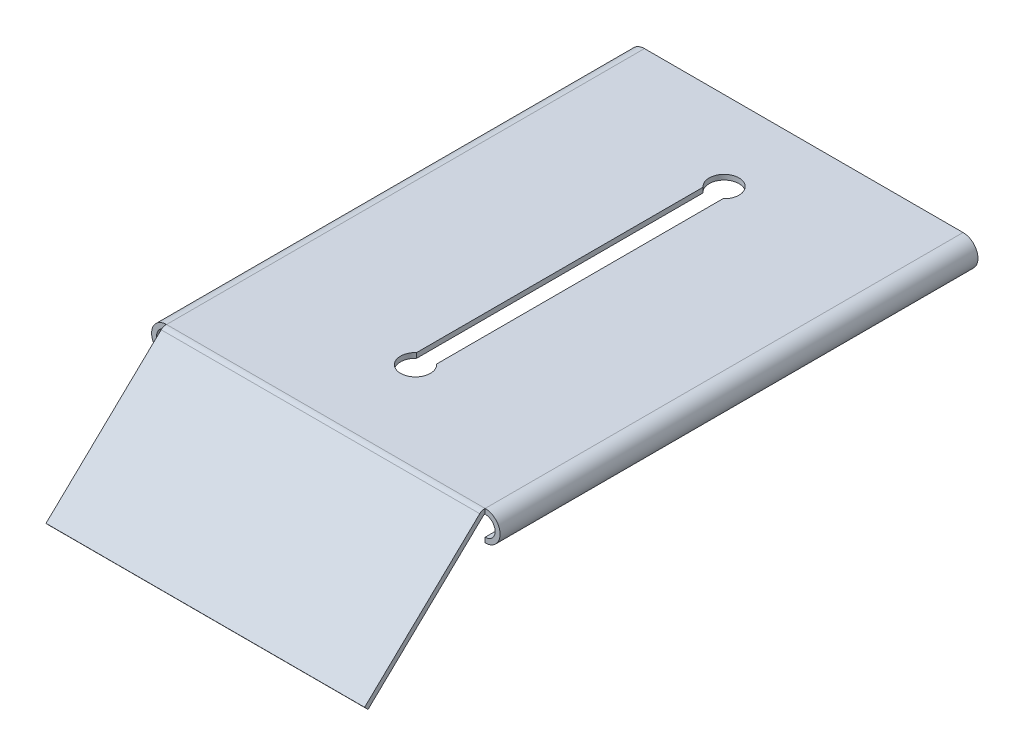
ISO-10303-21;
HEADER;
FILE_DESCRIPTION(('STEP AP214'),'2;1');
FILE_NAME('part.step','',(''),(''),'','','');
FILE_SCHEMA(('AUTOMOTIVE_DESIGN { 1 0 10303 214 1 1 1 1 }'));
ENDSEC;
DATA;
#1=APPLICATION_CONTEXT('core data for automotive mechanical design processes');
#2=APPLICATION_PROTOCOL_DEFINITION('international standard','automotive_design',2000,#1);
#3=PRODUCT_CONTEXT('',#1,'mechanical');
#4=PRODUCT('Part','Part','',(#3));
#5=PRODUCT_RELATED_PRODUCT_CATEGORY('part','',(#4));
#6=PRODUCT_DEFINITION_FORMATION('','',#4);
#7=PRODUCT_DEFINITION_CONTEXT('part definition',#1,'design');
#8=PRODUCT_DEFINITION('design','',#6,#7);
#9=PRODUCT_DEFINITION_SHAPE('','',#8);
#10=(LENGTH_UNIT() NAMED_UNIT(*) SI_UNIT(.MILLI.,.METRE.));
#11=(NAMED_UNIT(*) PLANE_ANGLE_UNIT() SI_UNIT($,.RADIAN.));
#12=(NAMED_UNIT(*) SI_UNIT($,.STERADIAN.) SOLID_ANGLE_UNIT());
#13=UNCERTAINTY_MEASURE_WITH_UNIT(LENGTH_MEASURE(1.E-05),#10,'distance_accuracy_value','');
#14=(GEOMETRIC_REPRESENTATION_CONTEXT(3) GLOBAL_UNCERTAINTY_ASSIGNED_CONTEXT((#13)) GLOBAL_UNIT_ASSIGNED_CONTEXT((#10,
#11,#12)) REPRESENTATION_CONTEXT('',''));
#15=CARTESIAN_POINT('',(0.,0.,0.));
#16=DIRECTION('',(0.,0.,1.));
#17=DIRECTION('',(1.,0.,0.));
#18=AXIS2_PLACEMENT_3D('',#15,#16,#17);
#19=CARTESIAN_POINT('',(-101.6,-3.17500000000001,152.4));
#20=DIRECTION('',(0.,0.,1.));
#21=DIRECTION('',(1.,0.,0.));
#22=AXIS2_PLACEMENT_3D('',#19,#20,#21);
#23=PLANE('',#22);
#24=CARTESIAN_POINT('',(-101.6,-3.17500000000001,152.4));
#25=DIRECTION('',(0.,0.,1.));
#26=DIRECTION('',(1.,0.,0.));
#27=AXIS2_PLACEMENT_3D('',#24,#25,#26);
#28=CIRCLE('',#27,3.175);
#29=CARTESIAN_POINT('',(-101.6,0.,152.4));
#30=VERTEX_POINT('',#29);
#31=CARTESIAN_POINT('',(-101.6,-6.35000000000001,152.4));
#32=VERTEX_POINT('',#31);
#33=EDGE_CURVE('E232',#30,#32,#28,.T.);
#34=ORIENTED_EDGE('',*,*,#33,.F.);
#35=DIRECTION('',(0.,1.,0.));
#36=VECTOR('',#35,1.);
#37=CARTESIAN_POINT('',(-101.6,0.,152.4));
#38=LINE('',#37,#36);
#39=CARTESIAN_POINT('',(-101.6,1.58749999999999,152.4));
#40=VERTEX_POINT('',#39);
#41=EDGE_CURVE('E156',#30,#40,#38,.T.);
#42=ORIENTED_EDGE('',*,*,#41,.T.);
#43=CARTESIAN_POINT('',(-101.6,-3.17500000000001,152.4));
#44=DIRECTION('',(0.,0.,1.));
#45=DIRECTION('',(1.,0.,0.));
#46=AXIS2_PLACEMENT_3D('',#43,#44,#45);
#47=CIRCLE('',#46,4.7625);
#48=CARTESIAN_POINT('',(-101.6,-7.93750000000001,152.4));
#49=VERTEX_POINT('',#48);
#50=EDGE_CURVE('E226',#40,#49,#47,.T.);
#51=ORIENTED_EDGE('',*,*,#50,.T.);
#52=DIRECTION('',(0.,-1.,0.));
#53=VECTOR('',#52,1.);
#54=CARTESIAN_POINT('',(-101.6,-6.35000000000001,152.4));
#55=LINE('',#54,#53);
#56=EDGE_CURVE('E228',#32,#49,#55,.T.);
#57=ORIENTED_EDGE('',*,*,#56,.F.);
#58=EDGE_LOOP('',(#34,#42,#51,#57));
#59=FACE_BOUND('',#58,.T.);
#60=ADVANCED_FACE('F33',(#59),#23,.T.);
#61=CARTESIAN_POINT('',(-101.6,-3.17500000000001,152.4));
#62=DIRECTION('',(0.,0.,-1.));
#63=DIRECTION('',(-1.,0.,0.));
#64=AXIS2_PLACEMENT_3D('',#61,#62,#63);
#65=CYLINDRICAL_SURFACE('',#64,4.7625);
#66=CARTESIAN_POINT('',(-101.6,-3.17500000000001,0.));
#67=DIRECTION('',(0.,0.,1.));
#68=DIRECTION('',(1.,0.,0.));
#69=AXIS2_PLACEMENT_3D('',#66,#67,#68);
#70=CIRCLE('',#69,4.7625);
#71=CARTESIAN_POINT('',(-101.6,1.58749999999999,0.));
#72=VERTEX_POINT('',#71);
#73=CARTESIAN_POINT('',(-101.6,-7.93750000000001,0.));
#74=VERTEX_POINT('',#73);
#75=EDGE_CURVE('E225',#72,#74,#70,.T.);
#76=ORIENTED_EDGE('',*,*,#75,.T.);
#77=DIRECTION('',(0.,0.,-1.));
#78=VECTOR('',#77,1.);
#79=CARTESIAN_POINT('',(-101.6,-7.93750000000001,152.4));
#80=LINE('',#79,#78);
#81=EDGE_CURVE('E11',#49,#74,#80,.T.);
#82=ORIENTED_EDGE('',*,*,#81,.F.);
#83=ORIENTED_EDGE('',*,*,#50,.F.);
#84=DIRECTION('',(0.,0.,-1.));
#85=VECTOR('',#84,1.);
#86=CARTESIAN_POINT('',(-101.6,1.58749999999999,152.4));
#87=LINE('',#86,#85);
#88=EDGE_CURVE('E248',#40,#72,#87,.T.);
#89=ORIENTED_EDGE('',*,*,#88,.T.);
#90=EDGE_LOOP('',(#76,#82,#83,#89));
#91=FACE_BOUND('',#90,.T.);
#92=ADVANCED_FACE('F35',(#91),#65,.T.);
#93=CARTESIAN_POINT('',(-101.6,-6.35000000000001,152.4));
#94=DIRECTION('',(1.,0.,0.));
#95=DIRECTION('',(0.,0.,-1.));
#96=AXIS2_PLACEMENT_3D('',#93,#94,#95);
#97=PLANE('',#96);
#98=DIRECTION('',(0.,-1.,0.));
#99=VECTOR('',#98,1.);
#100=CARTESIAN_POINT('',(-101.6,-6.35000000000001,0.));
#101=LINE('',#100,#99);
#102=CARTESIAN_POINT('',(-101.6,-6.35000000000001,0.));
#103=VERTEX_POINT('',#102);
#104=EDGE_CURVE('E251',#103,#74,#101,.T.);
#105=ORIENTED_EDGE('',*,*,#104,.F.);
#106=DIRECTION('',(0.,0.,-1.));
#107=VECTOR('',#106,1.);
#108=CARTESIAN_POINT('',(-101.6,-6.35000000000001,152.4));
#109=LINE('',#108,#107);
#110=EDGE_CURVE('E41',#32,#103,#109,.T.);
#111=ORIENTED_EDGE('',*,*,#110,.F.);
#112=ORIENTED_EDGE('',*,*,#56,.T.);
#113=ORIENTED_EDGE('',*,*,#81,.T.);
#114=EDGE_LOOP('',(#105,#111,#112,#113));
#115=FACE_BOUND('',#114,.T.);
#116=ADVANCED_FACE('F289',(#115),#97,.T.);
#117=CARTESIAN_POINT('',(-101.6,-3.17500000000001,152.4));
#118=DIRECTION('',(0.,0.,-1.));
#119=DIRECTION('',(-1.,0.,0.));
#120=AXIS2_PLACEMENT_3D('',#117,#118,#119);
#121=CYLINDRICAL_SURFACE('',#120,3.175);
#122=CARTESIAN_POINT('',(-101.6,-3.17500000000001,0.));
#123=DIRECTION('',(0.,0.,1.));
#124=DIRECTION('',(1.,0.,0.));
#125=AXIS2_PLACEMENT_3D('',#122,#123,#124);
#126=CIRCLE('',#125,3.175);
#127=CARTESIAN_POINT('',(-101.6,0.,0.));
#128=VERTEX_POINT('',#127);
#129=EDGE_CURVE('E254',#128,#103,#126,.T.);
#130=ORIENTED_EDGE('',*,*,#129,.F.);
#131=DIRECTION('',(0.,0.,-1.));
#132=VECTOR('',#131,1.);
#133=CARTESIAN_POINT('',(-101.6,0.,152.4));
#134=LINE('',#133,#132);
#135=EDGE_CURVE('E280',#30,#128,#134,.T.);
#136=ORIENTED_EDGE('',*,*,#135,.F.);
#137=ORIENTED_EDGE('',*,*,#33,.T.);
#138=ORIENTED_EDGE('',*,*,#110,.T.);
#139=EDGE_LOOP('',(#130,#136,#137,#138));
#140=FACE_BOUND('',#139,.T.);
#141=ADVANCED_FACE('F284',(#140),#121,.F.);
#142=CARTESIAN_POINT('',(0.,0.,152.4));
#143=DIRECTION('',(0.,-1.,0.));
#144=DIRECTION('',(1.,0.,0.));
#145=AXIS2_PLACEMENT_3D('',#142,#143,#144);
#146=PLANE('',#145);
#147=CARTESIAN_POINT('',(-50.8,0.,25.4));
#148=DIRECTION('',(0.,-1.,0.));
#149=DIRECTION('',(1.,0.,0.));
#150=AXIS2_PLACEMENT_3D('',#147,#148,#149);
#151=CIRCLE('',#150,4.7625);
#152=CARTESIAN_POINT('',(-53.975,0.,28.9497579142809));
#153=VERTEX_POINT('',#152);
#154=CARTESIAN_POINT('',(-47.625,0.,28.9497579142809));
#155=VERTEX_POINT('',#154);
#156=EDGE_CURVE('E223',#153,#155,#151,.T.);
#157=ORIENTED_EDGE('',*,*,#156,.F.);
#158=DIRECTION('',(0.,0.,-1.));
#159=VECTOR('',#158,1.);
#160=CARTESIAN_POINT('',(-53.975,0.,152.4));
#161=LINE('',#160,#159);
#162=CARTESIAN_POINT('',(-53.975,0.,120.275242085719));
#163=VERTEX_POINT('',#162);
#164=EDGE_CURVE('E213',#163,#153,#161,.T.);
#165=ORIENTED_EDGE('',*,*,#164,.F.);
#166=CARTESIAN_POINT('',(-50.8,0.,123.825));
#167=DIRECTION('',(0.,-1.,0.));
#168=DIRECTION('',(1.,0.,0.));
#169=AXIS2_PLACEMENT_3D('',#166,#167,#168);
#170=CIRCLE('',#169,4.7625);
#171=CARTESIAN_POINT('',(-47.625,0.,120.275242085719));
#172=VERTEX_POINT('',#171);
#173=EDGE_CURVE('E219',#172,#163,#170,.T.);
#174=ORIENTED_EDGE('',*,*,#173,.F.);
#175=DIRECTION('',(0.,0.,1.));
#176=VECTOR('',#175,1.);
#177=CARTESIAN_POINT('',(-47.625,0.,152.4));
#178=LINE('',#177,#176);
#179=EDGE_CURVE('E221',#155,#172,#178,.T.);
#180=ORIENTED_EDGE('',*,*,#179,.F.);
#181=EDGE_LOOP('',(#157,#165,#174,#180));
#182=FACE_BOUND('',#181,.T.);
#183=DIRECTION('',(-1.,0.,0.));
#184=VECTOR('',#183,1.);
#185=CARTESIAN_POINT('',(0.,0.,0.));
#186=LINE('',#185,#184);
#187=CARTESIAN_POINT('',(0.,0.,0.));
#188=VERTEX_POINT('',#187);
#189=EDGE_CURVE('E257',#188,#128,#186,.T.);
#190=ORIENTED_EDGE('',*,*,#189,.F.);
#191=DIRECTION('',(0.,0.,-1.));
#192=VECTOR('',#191,1.);
#193=CARTESIAN_POINT('',(0.,0.,152.4));
#194=LINE('',#193,#192);
#195=CARTESIAN_POINT('',(0.,0.,152.4));
#196=VERTEX_POINT('',#195);
#197=EDGE_CURVE('E278',#196,#188,#194,.T.);
#198=ORIENTED_EDGE('',*,*,#197,.F.);
#199=DIRECTION('',(-1.,0.,0.));
#200=VECTOR('',#199,1.);
#201=CARTESIAN_POINT('',(0.,0.,152.4));
#202=LINE('',#201,#200);
#203=EDGE_CURVE('E235',#196,#30,#202,.T.);
#204=ORIENTED_EDGE('',*,*,#203,.T.);
#205=ORIENTED_EDGE('',*,*,#135,.T.);
#206=EDGE_LOOP('',(#190,#198,#204,#205));
#207=FACE_BOUND('',#206,.T.);
#208=ADVANCED_FACE('F298',(#182,#207),#146,.T.);
#209=CARTESIAN_POINT('',(0.,-3.175,152.4));
#210=DIRECTION('',(0.,0.,-1.));
#211=DIRECTION('',(-1.,0.,0.));
#212=AXIS2_PLACEMENT_3D('',#209,#210,#211);
#213=CYLINDRICAL_SURFACE('',#212,3.175);
#214=CARTESIAN_POINT('',(0.,-3.175,0.));
#215=DIRECTION('',(0.,0.,1.));
#216=DIRECTION('',(-1.,0.,0.));
#217=AXIS2_PLACEMENT_3D('',#214,#215,#216);
#218=CIRCLE('',#217,3.175);
#219=CARTESIAN_POINT('',(0.,-6.35,0.));
#220=VERTEX_POINT('',#219);
#221=EDGE_CURVE('E260',#220,#188,#218,.T.);
#222=ORIENTED_EDGE('',*,*,#221,.F.);
#223=DIRECTION('',(0.,0.,-1.));
#224=VECTOR('',#223,1.);
#225=CARTESIAN_POINT('',(0.,-6.35,152.4));
#226=LINE('',#225,#224);
#227=CARTESIAN_POINT('',(0.,-6.35,152.4));
#228=VERTEX_POINT('',#227);
#229=EDGE_CURVE('E276',#228,#220,#226,.T.);
#230=ORIENTED_EDGE('',*,*,#229,.F.);
#231=CARTESIAN_POINT('',(0.,-3.175,152.4));
#232=DIRECTION('',(0.,0.,1.));
#233=DIRECTION('',(-1.,0.,0.));
#234=AXIS2_PLACEMENT_3D('',#231,#232,#233);
#235=CIRCLE('',#234,3.175);
#236=EDGE_CURVE('E238',#228,#196,#235,.T.);
#237=ORIENTED_EDGE('',*,*,#236,.T.);
#238=ORIENTED_EDGE('',*,*,#197,.T.);
#239=EDGE_LOOP('',(#222,#230,#237,#238));
#240=FACE_BOUND('',#239,.T.);
#241=ADVANCED_FACE('F317',(#240),#213,.F.);
#242=CARTESIAN_POINT('',(0.,-7.9375,152.4));
#243=DIRECTION('',(-1.,0.,0.));
#244=DIRECTION('',(0.,-1.,0.));
#245=AXIS2_PLACEMENT_3D('',#242,#243,#244);
#246=PLANE('',#245);
#247=DIRECTION('',(0.,1.,0.));
#248=VECTOR('',#247,1.);
#249=CARTESIAN_POINT('',(0.,-7.9375,0.));
#250=LINE('',#249,#248);
#251=CARTESIAN_POINT('',(0.,-7.9375,0.));
#252=VERTEX_POINT('',#251);
#253=EDGE_CURVE('E263',#252,#220,#250,.T.);
#254=ORIENTED_EDGE('',*,*,#253,.F.);
#255=DIRECTION('',(0.,0.,-1.));
#256=VECTOR('',#255,1.);
#257=CARTESIAN_POINT('',(0.,-7.9375,152.4));
#258=LINE('',#257,#256);
#259=CARTESIAN_POINT('',(0.,-7.9375,152.4));
#260=VERTEX_POINT('',#259);
#261=EDGE_CURVE('E274',#260,#252,#258,.T.);
#262=ORIENTED_EDGE('',*,*,#261,.F.);
#263=DIRECTION('',(0.,1.,0.));
#264=VECTOR('',#263,1.);
#265=CARTESIAN_POINT('',(0.,-7.9375,152.4));
#266=LINE('',#265,#264);
#267=EDGE_CURVE('E241',#260,#228,#266,.T.);
#268=ORIENTED_EDGE('',*,*,#267,.T.);
#269=ORIENTED_EDGE('',*,*,#229,.T.);
#270=EDGE_LOOP('',(#254,#262,#268,#269));
#271=FACE_BOUND('',#270,.T.);
#272=ADVANCED_FACE('F314',(#271),#246,.T.);
#273=CARTESIAN_POINT('',(0.,-3.175,152.4));
#274=DIRECTION('',(0.,0.,-1.));
#275=DIRECTION('',(-1.,0.,0.));
#276=AXIS2_PLACEMENT_3D('',#273,#274,#275);
#277=CYLINDRICAL_SURFACE('',#276,4.7625);
#278=CARTESIAN_POINT('',(0.,-3.175,0.));
#279=DIRECTION('',(0.,0.,1.));
#280=DIRECTION('',(1.,0.,0.));
#281=AXIS2_PLACEMENT_3D('',#278,#279,#280);
#282=CIRCLE('',#281,4.7625);
#283=CARTESIAN_POINT('',(0.,1.5875,0.));
#284=VERTEX_POINT('',#283);
#285=EDGE_CURVE('E266',#252,#284,#282,.T.);
#286=ORIENTED_EDGE('',*,*,#285,.T.);
#287=DIRECTION('',(0.,0.,-1.));
#288=VECTOR('',#287,1.);
#289=CARTESIAN_POINT('',(0.,1.5875,152.4));
#290=LINE('',#289,#288);
#291=CARTESIAN_POINT('',(0.,1.5875,152.4));
#292=VERTEX_POINT('',#291);
#293=EDGE_CURVE('E271',#292,#284,#290,.T.);
#294=ORIENTED_EDGE('',*,*,#293,.F.);
#295=CARTESIAN_POINT('',(0.,-3.175,152.4));
#296=DIRECTION('',(0.,0.,1.));
#297=DIRECTION('',(1.,0.,0.));
#298=AXIS2_PLACEMENT_3D('',#295,#296,#297);
#299=CIRCLE('',#298,4.7625);
#300=EDGE_CURVE('E244',#260,#292,#299,.T.);
#301=ORIENTED_EDGE('',*,*,#300,.F.);
#302=ORIENTED_EDGE('',*,*,#261,.T.);
#303=EDGE_LOOP('',(#286,#294,#301,#302));
#304=FACE_BOUND('',#303,.T.);
#305=ADVANCED_FACE('F311',(#304),#277,.T.);
#306=CARTESIAN_POINT('',(0.,1.5875,152.4));
#307=DIRECTION('',(0.,-1.,0.));
#308=DIRECTION('',(1.,0.,0.));
#309=AXIS2_PLACEMENT_3D('',#306,#307,#308);
#310=PLANE('',#309);
#311=DIRECTION('',(0.,0.,1.));
#312=VECTOR('',#311,1.);
#313=CARTESIAN_POINT('',(-53.975,1.58749999999999,120.275242085719));
#314=LINE('',#313,#312);
#315=CARTESIAN_POINT('',(-53.975,1.58749999999999,28.9497579142809));
#316=VERTEX_POINT('',#315);
#317=CARTESIAN_POINT('',(-53.975,1.58749999999999,120.275242085719));
#318=VERTEX_POINT('',#317);
#319=EDGE_CURVE('E202',#316,#318,#314,.T.);
#320=ORIENTED_EDGE('',*,*,#319,.F.);
#321=CARTESIAN_POINT('',(-50.8,1.58749999999999,25.4));
#322=DIRECTION('',(0.,1.,0.));
#323=DIRECTION('',(1.,0.,0.));
#324=AXIS2_PLACEMENT_3D('',#321,#322,#323);
#325=CIRCLE('',#324,4.7625);
#326=CARTESIAN_POINT('',(-47.625,1.58749999999999,28.9497579142809));
#327=VERTEX_POINT('',#326);
#328=EDGE_CURVE('E56',#327,#316,#325,.T.);
#329=ORIENTED_EDGE('',*,*,#328,.F.);
#330=DIRECTION('',(0.,0.,-1.));
#331=VECTOR('',#330,1.);
#332=CARTESIAN_POINT('',(-47.625,1.58749999999999,120.275242085719));
#333=LINE('',#332,#331);
#334=CARTESIAN_POINT('',(-47.625,1.58749999999999,120.275242085719));
#335=VERTEX_POINT('',#334);
#336=EDGE_CURVE('E207',#335,#327,#333,.T.);
#337=ORIENTED_EDGE('',*,*,#336,.F.);
#338=CARTESIAN_POINT('',(-50.8,1.58749999999999,123.825));
#339=DIRECTION('',(0.,1.,0.));
#340=DIRECTION('',(1.,0.,0.));
#341=AXIS2_PLACEMENT_3D('',#338,#339,#340);
#342=CIRCLE('',#341,4.7625);
#343=EDGE_CURVE('E204',#318,#335,#342,.T.);
#344=ORIENTED_EDGE('',*,*,#343,.F.);
#345=EDGE_LOOP('',(#320,#329,#337,#344));
#346=FACE_BOUND('',#345,.T.);
#347=DIRECTION('',(-1.,0.,0.));
#348=VECTOR('',#347,1.);
#349=CARTESIAN_POINT('',(0.,1.5875,0.));
#350=LINE('',#349,#348);
#351=EDGE_CURVE('E229',#284,#72,#350,.T.);
#352=ORIENTED_EDGE('',*,*,#351,.T.);
#353=ORIENTED_EDGE('',*,*,#88,.F.);
#354=DIRECTION('',(-1.,0.,0.));
#355=VECTOR('',#354,1.);
#356=CARTESIAN_POINT('',(0.,1.5875,152.4));
#357=LINE('',#356,#355);
#358=EDGE_CURVE('E170',#292,#40,#357,.T.);
#359=ORIENTED_EDGE('',*,*,#358,.F.);
#360=ORIENTED_EDGE('',*,*,#293,.T.);
#361=EDGE_LOOP('',(#352,#353,#359,#360));
#362=FACE_BOUND('',#361,.T.);
#363=ADVANCED_FACE('F307',(#346,#362),#310,.F.);
#364=DIRECTION('',(0.,1.,0.));
#365=VECTOR('',#364,1.);
#366=CARTESIAN_POINT('',(0.,0.,152.4));
#367=LINE('',#366,#365);
#368=EDGE_CURVE('E172',#196,#292,#367,.T.);
#369=ORIENTED_EDGE('',*,*,#368,.F.);
#370=ORIENTED_EDGE('',*,*,#236,.F.);
#371=ORIENTED_EDGE('',*,*,#267,.F.);
#372=ORIENTED_EDGE('',*,*,#300,.T.);
#373=EDGE_LOOP('',(#369,#370,#371,#372));
#374=FACE_BOUND('',#373,.T.);
#375=ADVANCED_FACE('F320',(#374),#23,.T.);
#376=CARTESIAN_POINT('',(-101.6,-3.17500000000001,0.));
#377=DIRECTION('',(0.,0.,1.));
#378=DIRECTION('',(1.,0.,0.));
#379=AXIS2_PLACEMENT_3D('',#376,#377,#378);
#380=PLANE('',#379);
#381=ORIENTED_EDGE('',*,*,#75,.F.);
#382=ORIENTED_EDGE('',*,*,#351,.F.);
#383=ORIENTED_EDGE('',*,*,#285,.F.);
#384=ORIENTED_EDGE('',*,*,#253,.T.);
#385=ORIENTED_EDGE('',*,*,#221,.T.);
#386=ORIENTED_EDGE('',*,*,#189,.T.);
#387=ORIENTED_EDGE('',*,*,#129,.T.);
#388=ORIENTED_EDGE('',*,*,#104,.T.);
#389=EDGE_LOOP('',(#381,#382,#383,#384,#385,#386,#387,#388));
#390=FACE_BOUND('',#389,.T.);
#391=ADVANCED_FACE('F293',(#390),#380,.F.);
#392=CARTESIAN_POINT('',(-50.8,-7.93750000000001,25.4));
#393=DIRECTION('',(0.,1.,0.));
#394=DIRECTION('',(-1.,0.,0.));
#395=AXIS2_PLACEMENT_3D('',#392,#393,#394);
#396=CYLINDRICAL_SURFACE('',#395,4.7625);
#397=ORIENTED_EDGE('',*,*,#156,.T.);
#398=DIRECTION('',(0.,1.,0.));
#399=VECTOR('',#398,1.);
#400=CARTESIAN_POINT('',(-47.625,-7.93750000000001,28.9497579142809));
#401=LINE('',#400,#399);
#402=EDGE_CURVE('E211',#155,#327,#401,.T.);
#403=ORIENTED_EDGE('',*,*,#402,.T.);
#404=ORIENTED_EDGE('',*,*,#328,.T.);
#405=DIRECTION('',(0.,1.,0.));
#406=VECTOR('',#405,1.);
#407=CARTESIAN_POINT('',(-53.975,-7.93750000000001,28.9497579142809));
#408=LINE('',#407,#406);
#409=EDGE_CURVE('E210',#153,#316,#408,.T.);
#410=ORIENTED_EDGE('',*,*,#409,.F.);
#411=EDGE_LOOP('',(#397,#403,#404,#410));
#412=FACE_BOUND('',#411,.T.);
#413=ADVANCED_FACE('F355',(#412),#396,.F.);
#414=CARTESIAN_POINT('',(-47.625,-7.93750000000001,120.275242085719));
#415=DIRECTION('',(1.,0.,0.));
#416=DIRECTION('',(0.,0.,-1.));
#417=AXIS2_PLACEMENT_3D('',#414,#415,#416);
#418=PLANE('',#417);
#419=ORIENTED_EDGE('',*,*,#179,.T.);
#420=DIRECTION('',(0.,1.,0.));
#421=VECTOR('',#420,1.);
#422=CARTESIAN_POINT('',(-47.625,-7.93750000000001,120.275242085719));
#423=LINE('',#422,#421);
#424=EDGE_CURVE('E214',#172,#335,#423,.T.);
#425=ORIENTED_EDGE('',*,*,#424,.T.);
#426=ORIENTED_EDGE('',*,*,#336,.T.);
#427=ORIENTED_EDGE('',*,*,#402,.F.);
#428=EDGE_LOOP('',(#419,#425,#426,#427));
#429=FACE_BOUND('',#428,.T.);
#430=ADVANCED_FACE('F424',(#429),#418,.F.);
#431=CARTESIAN_POINT('',(-50.8,-7.93750000000001,123.825));
#432=DIRECTION('',(0.,1.,0.));
#433=DIRECTION('',(-1.,0.,0.));
#434=AXIS2_PLACEMENT_3D('',#431,#432,#433);
#435=CYLINDRICAL_SURFACE('',#434,4.7625);
#436=ORIENTED_EDGE('',*,*,#173,.T.);
#437=DIRECTION('',(0.,1.,0.));
#438=VECTOR('',#437,1.);
#439=CARTESIAN_POINT('',(-53.975,-7.93750000000001,120.275242085719));
#440=LINE('',#439,#438);
#441=EDGE_CURVE('E48',#163,#318,#440,.T.);
#442=ORIENTED_EDGE('',*,*,#441,.T.);
#443=ORIENTED_EDGE('',*,*,#343,.T.);
#444=ORIENTED_EDGE('',*,*,#424,.F.);
#445=EDGE_LOOP('',(#436,#442,#443,#444));
#446=FACE_BOUND('',#445,.T.);
#447=ADVANCED_FACE('F430',(#446),#435,.F.);
#448=CARTESIAN_POINT('',(-53.975,-7.93750000000001,120.275242085719));
#449=DIRECTION('',(-1.,0.,0.));
#450=DIRECTION('',(0.,-1.,0.));
#451=AXIS2_PLACEMENT_3D('',#448,#449,#450);
#452=PLANE('',#451);
#453=ORIENTED_EDGE('',*,*,#164,.T.);
#454=ORIENTED_EDGE('',*,*,#409,.T.);
#455=ORIENTED_EDGE('',*,*,#319,.T.);
#456=ORIENTED_EDGE('',*,*,#441,.F.);
#457=EDGE_LOOP('',(#453,#454,#455,#456));
#458=FACE_BOUND('',#457,.T.);
#459=ADVANCED_FACE('F438',(#458),#452,.F.);
#460=CARTESIAN_POINT('',(-101.6,-0.571923921059275,152.625644331314));
#461=DIRECTION('',(1.,0.,0.));
#462=DIRECTION('',(0.,0.,-1.));
#463=AXIS2_PLACEMENT_3D('',#460,#461,#462);
#464=CYLINDRICAL_SURFACE('',#463,2.1711810231064);
#465=CARTESIAN_POINT('',(0.,-0.571923921059275,152.625644331314));
#466=DIRECTION('',(1.,0.,0.));
#467=DIRECTION('',(0.,0.,1.));
#468=AXIS2_PLACEMENT_3D('',#465,#466,#467);
#469=CIRCLE('',#468,2.1711810231064);
#470=CARTESIAN_POINT('',(0.,0.997401867286126,154.126058809094));
#471=VERTEX_POINT('',#470);
#472=EDGE_CURVE('E185',#292,#471,#469,.T.);
#473=ORIENTED_EDGE('',*,*,#472,.F.);
#474=ORIENTED_EDGE('',*,*,#358,.T.);
#475=CARTESIAN_POINT('',(-101.6,-0.571923921059275,152.625644331314));
#476=DIRECTION('',(1.,0.,0.));
#477=DIRECTION('',(0.,0.,1.));
#478=AXIS2_PLACEMENT_3D('',#475,#476,#477);
#479=CIRCLE('',#478,2.1711810231064);
#480=CARTESIAN_POINT('',(-101.6,0.997401867286126,154.126058809094));
#481=VERTEX_POINT('',#480);
#482=EDGE_CURVE('E162',#40,#481,#479,.T.);
#483=ORIENTED_EDGE('',*,*,#482,.T.);
#484=DIRECTION('',(1.,0.,0.));
#485=VECTOR('',#484,1.);
#486=CARTESIAN_POINT('',(-101.6,0.997401867286126,154.126058809094));
#487=LINE('',#486,#485);
#488=EDGE_CURVE('E146',#481,#471,#487,.T.);
#489=ORIENTED_EDGE('',*,*,#488,.T.);
#490=EDGE_LOOP('',(#473,#474,#483,#489));
#491=FACE_BOUND('',#490,.T.);
#492=ADVANCED_FACE('F168',(#491),#464,.T.);
#493=CARTESIAN_POINT('',(-101.6,-0.613277064477394,152.586107062796));
#494=DIRECTION('',(1.,0.,0.));
#495=DIRECTION('',(0.,0.,-1.));
#496=AXIS2_PLACEMENT_3D('',#493,#494,#495);
#497=CYLINDRICAL_SURFACE('',#496,0.640893592288672);
#498=CARTESIAN_POINT('',(0.,-0.613277064477394,152.586107062796));
#499=DIRECTION('',(-1.,0.,0.));
#500=DIRECTION('',(0.,0.,1.));
#501=AXIS2_PLACEMENT_3D('',#498,#499,#500);
#502=CIRCLE('',#501,0.640893592288672);
#503=CARTESIAN_POINT('',(0.,-0.150040313943845,153.029002433727));
#504=VERTEX_POINT('',#503);
#505=EDGE_CURVE('E175',#504,#196,#502,.T.);
#506=ORIENTED_EDGE('',*,*,#505,.F.);
#507=DIRECTION('',(1.,0.,0.));
#508=VECTOR('',#507,1.);
#509=CARTESIAN_POINT('',(-101.6,-0.150040313943845,153.029002433727));
#510=LINE('',#509,#508);
#511=CARTESIAN_POINT('',(-101.6,-0.150040313943845,153.029002433727));
#512=VERTEX_POINT('',#511);
#513=EDGE_CURVE('E196',#512,#504,#510,.T.);
#514=ORIENTED_EDGE('',*,*,#513,.F.);
#515=CARTESIAN_POINT('',(-101.6,-0.613277064477394,152.586107062796));
#516=DIRECTION('',(-1.,0.,0.));
#517=DIRECTION('',(0.,0.,1.));
#518=AXIS2_PLACEMENT_3D('',#515,#516,#517);
#519=CIRCLE('',#518,0.640893592288672);
#520=EDGE_CURVE('E182',#512,#30,#519,.T.);
#521=ORIENTED_EDGE('',*,*,#520,.T.);
#522=ORIENTED_EDGE('',*,*,#203,.F.);
#523=EDGE_LOOP('',(#506,#514,#521,#522));
#524=FACE_BOUND('',#523,.T.);
#525=ADVANCED_FACE('F326',(#524),#497,.F.);
#526=CARTESIAN_POINT('',(-101.6,-35.2558443257002,189.747152233086));
#527=DIRECTION('',(0.,-0.722798224396827,-0.691059134089692));
#528=DIRECTION('',(0.,0.691059134089692,-0.722798224396827));
#529=AXIS2_PLACEMENT_3D('',#526,#527,#528);
#530=PLANE('',#529);
#531=DIRECTION('',(0.,0.691059134089692,-0.722798224396827));
#532=VECTOR('',#531,1.);
#533=CARTESIAN_POINT('',(0.,-35.2558443257002,189.747152233086));
#534=LINE('',#533,#532);
#535=CARTESIAN_POINT('',(0.,-35.2558443257002,189.747152233086));
#536=VERTEX_POINT('',#535);
#537=EDGE_CURVE('E191',#536,#504,#534,.T.);
#538=ORIENTED_EDGE('',*,*,#537,.F.);
#539=DIRECTION('',(1.,0.,0.));
#540=VECTOR('',#539,1.);
#541=CARTESIAN_POINT('',(-101.6,-35.2558443257002,189.747152233086));
#542=LINE('',#541,#540);
#543=CARTESIAN_POINT('',(-101.6,-35.2558443257002,189.747152233086));
#544=VERTEX_POINT('',#543);
#545=EDGE_CURVE('E198',#544,#536,#542,.T.);
#546=ORIENTED_EDGE('',*,*,#545,.F.);
#547=DIRECTION('',(0.,0.691059134089692,-0.722798224396827));
#548=VECTOR('',#547,1.);
#549=CARTESIAN_POINT('',(-101.6,-35.2558443257002,189.747152233086));
#550=LINE('',#549,#548);
#551=EDGE_CURVE('E179',#544,#512,#550,.T.);
#552=ORIENTED_EDGE('',*,*,#551,.T.);
#553=ORIENTED_EDGE('',*,*,#513,.T.);
#554=EDGE_LOOP('',(#538,#546,#552,#553));
#555=FACE_BOUND('',#554,.T.);
#556=ADVANCED_FACE('F329',(#555),#530,.T.);
#557=CARTESIAN_POINT('',(-101.6,-34.1084021444702,190.844208608453));
#558=DIRECTION('',(0.,-0.691059134089691,0.722798224396827));
#559=DIRECTION('',(0.,-0.722798224396827,-0.691059134089691));
#560=AXIS2_PLACEMENT_3D('',#557,#558,#559);
#561=PLANE('',#560);
#562=DIRECTION('',(0.,-0.722798224396827,-0.691059134089691));
#563=VECTOR('',#562,1.);
#564=CARTESIAN_POINT('',(0.,-34.1084021444702,190.844208608453));
#565=LINE('',#564,#563);
#566=CARTESIAN_POINT('',(0.,-34.1084021444702,190.844208608453));
#567=VERTEX_POINT('',#566);
#568=EDGE_CURVE('E188',#567,#536,#565,.T.);
#569=ORIENTED_EDGE('',*,*,#568,.F.);
#570=DIRECTION('',(1.,0.,0.));
#571=VECTOR('',#570,1.);
#572=CARTESIAN_POINT('',(-101.6,-34.1084021444702,190.844208608453));
#573=LINE('',#572,#571);
#574=CARTESIAN_POINT('',(-101.6,-34.1084021444702,190.844208608453));
#575=VERTEX_POINT('',#574);
#576=EDGE_CURVE('E155',#575,#567,#573,.T.);
#577=ORIENTED_EDGE('',*,*,#576,.F.);
#578=DIRECTION('',(0.,-0.722798224396827,-0.691059134089691));
#579=VECTOR('',#578,1.);
#580=CARTESIAN_POINT('',(-101.6,-34.1084021444702,190.844208608453));
#581=LINE('',#580,#579);
#582=EDGE_CURVE('E166',#575,#544,#581,.T.);
#583=ORIENTED_EDGE('',*,*,#582,.T.);
#584=ORIENTED_EDGE('',*,*,#545,.T.);
#585=EDGE_LOOP('',(#569,#577,#583,#584));
#586=FACE_BOUND('',#585,.T.);
#587=ADVANCED_FACE('F332',(#586),#561,.T.);
#588=CARTESIAN_POINT('',(-101.6,0.997401867286126,154.126058809094));
#589=DIRECTION('',(0.,0.722798224396827,0.691059134089692));
#590=DIRECTION('',(0.,-0.691059134089692,0.722798224396827));
#591=AXIS2_PLACEMENT_3D('',#588,#589,#590);
#592=PLANE('',#591);
#593=DIRECTION('',(0.,-0.691059134089692,0.722798224396827));
#594=VECTOR('',#593,1.);
#595=CARTESIAN_POINT('',(0.,0.997401867286126,154.126058809094));
#596=LINE('',#595,#594);
#597=EDGE_CURVE('E151',#471,#567,#596,.T.);
#598=ORIENTED_EDGE('',*,*,#597,.F.);
#599=ORIENTED_EDGE('',*,*,#488,.F.);
#600=DIRECTION('',(0.,-0.691059134089692,0.722798224396827));
#601=VECTOR('',#600,1.);
#602=CARTESIAN_POINT('',(-101.6,0.997401867286126,154.126058809094));
#603=LINE('',#602,#601);
#604=EDGE_CURVE('E149',#481,#575,#603,.T.);
#605=ORIENTED_EDGE('',*,*,#604,.T.);
#606=ORIENTED_EDGE('',*,*,#576,.T.);
#607=EDGE_LOOP('',(#598,#599,#605,#606));
#608=FACE_BOUND('',#607,.T.);
#609=ADVANCED_FACE('F148',(#608),#592,.T.);
#610=CARTESIAN_POINT('',(-101.6,-0.571923921059275,152.625644331314));
#611=DIRECTION('',(-1.,0.,0.));
#612=DIRECTION('',(0.,0.,1.));
#613=AXIS2_PLACEMENT_3D('',#610,#611,#612);
#614=PLANE('',#613);
#615=ORIENTED_EDGE('',*,*,#482,.F.);
#616=ORIENTED_EDGE('',*,*,#41,.F.);
#617=ORIENTED_EDGE('',*,*,#520,.F.);
#618=ORIENTED_EDGE('',*,*,#551,.F.);
#619=ORIENTED_EDGE('',*,*,#582,.F.);
#620=ORIENTED_EDGE('',*,*,#604,.F.);
#621=EDGE_LOOP('',(#615,#616,#617,#618,#619,#620));
#622=FACE_BOUND('',#621,.T.);
#623=ADVANCED_FACE('F160',(#622),#614,.T.);
#624=CARTESIAN_POINT('',(0.,-0.571923921059275,152.625644331314));
#625=DIRECTION('',(-1.,0.,0.));
#626=DIRECTION('',(0.,0.,1.));
#627=AXIS2_PLACEMENT_3D('',#624,#625,#626);
#628=PLANE('',#627);
#629=ORIENTED_EDGE('',*,*,#472,.T.);
#630=ORIENTED_EDGE('',*,*,#597,.T.);
#631=ORIENTED_EDGE('',*,*,#568,.T.);
#632=ORIENTED_EDGE('',*,*,#537,.T.);
#633=ORIENTED_EDGE('',*,*,#505,.T.);
#634=ORIENTED_EDGE('',*,*,#368,.T.);
#635=EDGE_LOOP('',(#629,#630,#631,#632,#633,#634));
#636=FACE_BOUND('',#635,.T.);
#637=ADVANCED_FACE('F322',(#636),#628,.F.);
#638=CLOSED_SHELL('',(#60,#92,#116,#141,#208,#241,#272,#305,#363,#375,#391,#413,#430,#447,#459,
#492,#525,#556,#587,#609,#623,#637));
#639=MANIFOLD_SOLID_BREP('B2',#638);
#640=ADVANCED_BREP_SHAPE_REPRESENTATION('',(#18,#639),#14);
#641=SHAPE_DEFINITION_REPRESENTATION(#9,#640);
ENDSEC;
END-ISO-10303-21;
